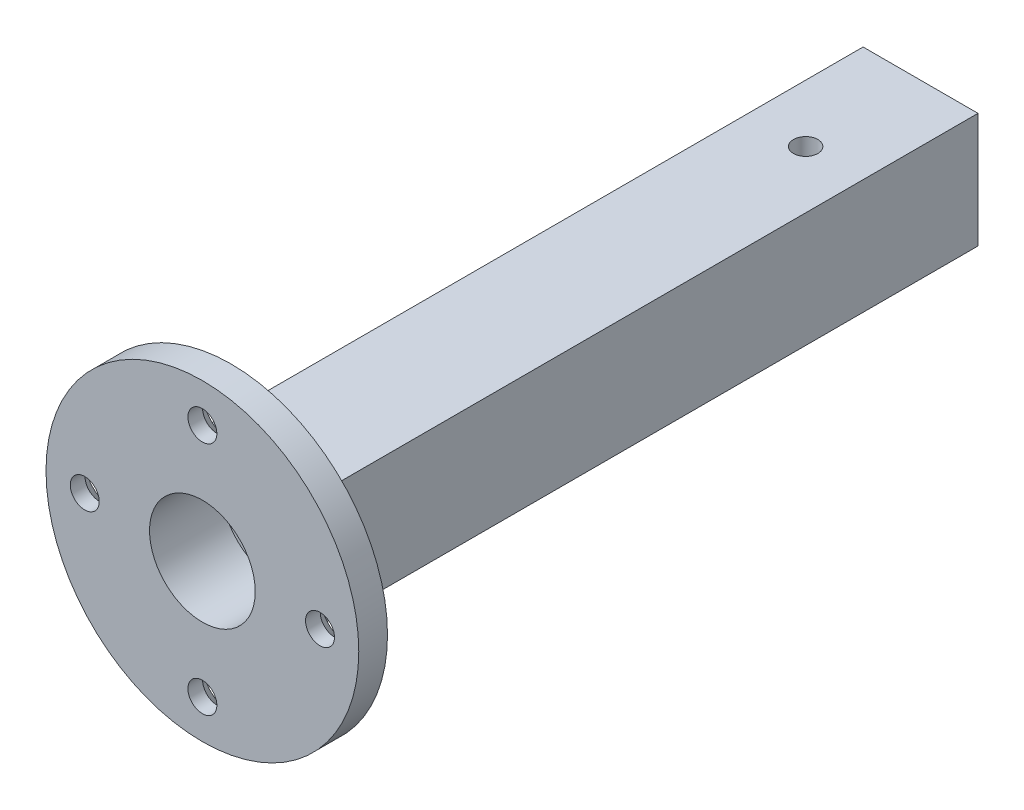
ISO-10303-21;
HEADER;
FILE_DESCRIPTION(('STEP AP214'),'2;1');
FILE_NAME('part.step','',(''),(''),'','','');
FILE_SCHEMA(('AUTOMOTIVE_DESIGN { 1 0 10303 214 1 1 1 1 }'));
ENDSEC;
DATA;
#1=APPLICATION_CONTEXT('core data for automotive mechanical design processes');
#2=APPLICATION_PROTOCOL_DEFINITION('international standard','automotive_design',2000,#1);
#3=PRODUCT_CONTEXT('',#1,'mechanical');
#4=PRODUCT('Part','Part','',(#3));
#5=PRODUCT_RELATED_PRODUCT_CATEGORY('part','',(#4));
#6=PRODUCT_DEFINITION_FORMATION('','',#4);
#7=PRODUCT_DEFINITION_CONTEXT('part definition',#1,'design');
#8=PRODUCT_DEFINITION('design','',#6,#7);
#9=PRODUCT_DEFINITION_SHAPE('','',#8);
#10=(LENGTH_UNIT() NAMED_UNIT(*) SI_UNIT(.MILLI.,.METRE.));
#11=(NAMED_UNIT(*) PLANE_ANGLE_UNIT() SI_UNIT($,.RADIAN.));
#12=(NAMED_UNIT(*) SI_UNIT($,.STERADIAN.) SOLID_ANGLE_UNIT());
#13=UNCERTAINTY_MEASURE_WITH_UNIT(LENGTH_MEASURE(1.E-05),#10,'distance_accuracy_value','');
#14=(GEOMETRIC_REPRESENTATION_CONTEXT(3) GLOBAL_UNCERTAINTY_ASSIGNED_CONTEXT((#13)) GLOBAL_UNIT_ASSIGNED_CONTEXT((#10,
#11,#12)) REPRESENTATION_CONTEXT('',''));
#15=CARTESIAN_POINT('',(0.,0.,0.));
#16=DIRECTION('',(0.,0.,1.));
#17=DIRECTION('',(1.,0.,0.));
#18=AXIS2_PLACEMENT_3D('',#15,#16,#17);
#19=CARTESIAN_POINT('',(6.35,6.35,71.375));
#20=DIRECTION('',(0.,0.,1.));
#21=DIRECTION('',(1.,0.,0.));
#22=AXIS2_PLACEMENT_3D('',#19,#20,#21);
#23=PLANE('',#22);
#24=CARTESIAN_POINT('',(6.35,6.35,71.375));
#25=DIRECTION('',(0.,0.,1.));
#26=DIRECTION('',(1.,0.,0.));
#27=AXIS2_PLACEMENT_3D('',#24,#25,#26);
#28=CIRCLE('',#27,5.842);
#29=CARTESIAN_POINT('',(12.192,6.35,71.375));
#30=VERTEX_POINT('',#29);
#31=EDGE_CURVE('E20',#30,#30,#28,.T.);
#32=ORIENTED_EDGE('',*,*,#31,.T.);
#33=EDGE_LOOP('',(#32));
#34=FACE_BOUND('',#33,.T.);
#35=ADVANCED_FACE('F17',(#34),#23,.T.);
#36=CARTESIAN_POINT('',(6.35,6.35,71.375));
#37=DIRECTION('',(0.,0.,1.));
#38=DIRECTION('',(1.,0.,0.));
#39=AXIS2_PLACEMENT_3D('',#36,#37,#38);
#40=CYLINDRICAL_SURFACE('',#39,5.842);
#41=CARTESIAN_POINT('',(6.35,6.35,79.375));
#42=DIRECTION('',(0.,0.,1.));
#43=DIRECTION('',(1.,0.,0.));
#44=AXIS2_PLACEMENT_3D('',#41,#42,#43);
#45=CIRCLE('',#44,5.842);
#46=CARTESIAN_POINT('',(12.192,6.35,79.375));
#47=VERTEX_POINT('',#46);
#48=EDGE_CURVE('E193',#47,#47,#45,.F.);
#49=ORIENTED_EDGE('',*,*,#48,.F.);
#50=EDGE_LOOP('',(#49));
#51=FACE_BOUND('',#50,.T.);
#52=ORIENTED_EDGE('',*,*,#31,.F.);
#53=EDGE_LOOP('',(#52));
#54=FACE_BOUND('',#53,.T.);
#55=ADVANCED_FACE('F182',(#51,#54),#40,.F.);
#56=CARTESIAN_POINT('',(6.35,6.35,25.4));
#57=DIRECTION('',(0.,0.,-1.));
#58=DIRECTION('',(-1.,0.,0.));
#59=AXIS2_PLACEMENT_3D('',#56,#57,#58);
#60=PLANE('',#59);
#61=CARTESIAN_POINT('',(6.35,6.35,25.4));
#62=DIRECTION('',(0.,0.,-1.));
#63=DIRECTION('',(-1.,0.,0.));
#64=AXIS2_PLACEMENT_3D('',#61,#62,#63);
#65=CIRCLE('',#64,4.064);
#66=CARTESIAN_POINT('',(2.286,6.35,25.4));
#67=VERTEX_POINT('',#66);
#68=EDGE_CURVE('E213',#67,#67,#65,.T.);
#69=ORIENTED_EDGE('',*,*,#68,.T.);
#70=EDGE_LOOP('',(#69));
#71=FACE_BOUND('',#70,.T.);
#72=ADVANCED_FACE('F179',(#71),#60,.T.);
#73=CARTESIAN_POINT('',(6.35,19.35,76.2));
#74=DIRECTION('',(0.,0.,-1.));
#75=DIRECTION('',(-1.,0.,0.));
#76=AXIS2_PLACEMENT_3D('',#73,#74,#75);
#77=CYLINDRICAL_SURFACE('',#76,1.6);
#78=CARTESIAN_POINT('',(6.35,19.35,79.375));
#79=DIRECTION('',(0.,0.,-1.));
#80=DIRECTION('',(-1.,0.,0.));
#81=AXIS2_PLACEMENT_3D('',#78,#79,#80);
#82=CIRCLE('',#81,1.6);
#83=CARTESIAN_POINT('',(4.75,19.35,79.375));
#84=VERTEX_POINT('',#83);
#85=EDGE_CURVE('E196',#84,#84,#82,.T.);
#86=ORIENTED_EDGE('',*,*,#85,.F.);
#87=EDGE_LOOP('',(#86));
#88=FACE_BOUND('',#87,.T.);
#89=CARTESIAN_POINT('',(6.35,19.35,77.7499999999804));
#90=DIRECTION('',(0.,0.,-1.));
#91=DIRECTION('',(-1.,0.,0.));
#92=AXIS2_PLACEMENT_3D('',#89,#90,#91);
#93=CIRCLE('',#92,1.59999999994179);
#94=CARTESIAN_POINT('',(4.75000000005821,19.35,77.7499999999804));
#95=VERTEX_POINT('',#94);
#96=EDGE_CURVE('E215',#95,#95,#93,.T.);
#97=ORIENTED_EDGE('',*,*,#96,.T.);
#98=EDGE_LOOP('',(#97));
#99=FACE_BOUND('',#98,.T.);
#100=ADVANCED_FACE('F175',(#88,#99),#77,.F.);
#101=CARTESIAN_POINT('',(-6.65,6.35,76.2));
#102=DIRECTION('',(0.,0.,-1.));
#103=DIRECTION('',(-1.,0.,0.));
#104=AXIS2_PLACEMENT_3D('',#101,#102,#103);
#105=CYLINDRICAL_SURFACE('',#104,1.6);
#106=CARTESIAN_POINT('',(-6.65,6.35,79.375));
#107=DIRECTION('',(0.,0.,-1.));
#108=DIRECTION('',(-1.,0.,0.));
#109=AXIS2_PLACEMENT_3D('',#106,#107,#108);
#110=CIRCLE('',#109,1.6);
#111=CARTESIAN_POINT('',(-8.25,6.35,79.375));
#112=VERTEX_POINT('',#111);
#113=EDGE_CURVE('E199',#112,#112,#110,.T.);
#114=ORIENTED_EDGE('',*,*,#113,.F.);
#115=EDGE_LOOP('',(#114));
#116=FACE_BOUND('',#115,.T.);
#117=CARTESIAN_POINT('',(-6.65,6.35,77.7500000000373));
#118=DIRECTION('',(0.,0.,-1.));
#119=DIRECTION('',(-1.,0.,0.));
#120=AXIS2_PLACEMENT_3D('',#117,#118,#119);
#121=CIRCLE('',#120,1.59999999997544);
#122=CARTESIAN_POINT('',(-8.24999999997544,6.35,77.7500000000373));
#123=VERTEX_POINT('',#122);
#124=EDGE_CURVE('E228',#123,#123,#121,.T.);
#125=ORIENTED_EDGE('',*,*,#124,.T.);
#126=EDGE_LOOP('',(#125));
#127=FACE_BOUND('',#126,.T.);
#128=ADVANCED_FACE('F171',(#116,#127),#105,.F.);
#129=CARTESIAN_POINT('',(6.35,-6.65,76.2));
#130=DIRECTION('',(0.,0.,-1.));
#131=DIRECTION('',(-1.,0.,0.));
#132=AXIS2_PLACEMENT_3D('',#129,#130,#131);
#133=CYLINDRICAL_SURFACE('',#132,1.6);
#134=CARTESIAN_POINT('',(6.35,-6.65,79.375));
#135=DIRECTION('',(0.,0.,-1.));
#136=DIRECTION('',(-1.,0.,0.));
#137=AXIS2_PLACEMENT_3D('',#134,#135,#136);
#138=CIRCLE('',#137,1.6);
#139=CARTESIAN_POINT('',(4.75,-6.65,79.375));
#140=VERTEX_POINT('',#139);
#141=EDGE_CURVE('E204',#140,#140,#138,.T.);
#142=ORIENTED_EDGE('',*,*,#141,.F.);
#143=EDGE_LOOP('',(#142));
#144=FACE_BOUND('',#143,.T.);
#145=CARTESIAN_POINT('',(6.35,-6.65,77.7499999999804));
#146=DIRECTION('',(0.,0.,-1.));
#147=DIRECTION('',(-1.,0.,0.));
#148=AXIS2_PLACEMENT_3D('',#145,#146,#147);
#149=CIRCLE('',#148,1.59999999994179);
#150=CARTESIAN_POINT('',(4.75000000005821,-6.65,77.7499999999804));
#151=VERTEX_POINT('',#150);
#152=EDGE_CURVE('E223',#151,#151,#149,.T.);
#153=ORIENTED_EDGE('',*,*,#152,.T.);
#154=EDGE_LOOP('',(#153));
#155=FACE_BOUND('',#154,.T.);
#156=ADVANCED_FACE('F167',(#144,#155),#133,.F.);
#157=CARTESIAN_POINT('',(19.35,6.35,76.2));
#158=DIRECTION('',(0.,0.,-1.));
#159=DIRECTION('',(-1.,0.,0.));
#160=AXIS2_PLACEMENT_3D('',#157,#158,#159);
#161=CYLINDRICAL_SURFACE('',#160,1.6);
#162=CARTESIAN_POINT('',(19.35,6.35,79.375));
#163=DIRECTION('',(0.,0.,-1.));
#164=DIRECTION('',(-1.,0.,0.));
#165=AXIS2_PLACEMENT_3D('',#162,#163,#164);
#166=CIRCLE('',#165,1.6);
#167=CARTESIAN_POINT('',(17.75,6.35,79.375));
#168=VERTEX_POINT('',#167);
#169=EDGE_CURVE('E207',#168,#168,#166,.T.);
#170=ORIENTED_EDGE('',*,*,#169,.F.);
#171=EDGE_LOOP('',(#170));
#172=FACE_BOUND('',#171,.T.);
#173=CARTESIAN_POINT('',(19.35,6.35,77.7499999999804));
#174=DIRECTION('',(0.,0.,-1.));
#175=DIRECTION('',(-1.,0.,0.));
#176=AXIS2_PLACEMENT_3D('',#173,#174,#175);
#177=CIRCLE('',#176,1.60000000002183);
#178=CARTESIAN_POINT('',(17.7499999999782,6.35,77.7499999999804));
#179=VERTEX_POINT('',#178);
#180=EDGE_CURVE('E218',#179,#179,#177,.T.);
#181=ORIENTED_EDGE('',*,*,#180,.T.);
#182=EDGE_LOOP('',(#181));
#183=FACE_BOUND('',#182,.T.);
#184=ADVANCED_FACE('F163',(#172,#183),#161,.F.);
#185=CARTESIAN_POINT('',(6.35,6.35,79.375));
#186=DIRECTION('',(0.,0.,1.));
#187=DIRECTION('',(1.,0.,0.));
#188=AXIS2_PLACEMENT_3D('',#185,#186,#187);
#189=PLANE('',#188);
#190=CARTESIAN_POINT('',(6.35,6.35,79.375));
#191=DIRECTION('',(0.,0.,-1.));
#192=DIRECTION('',(-1.,0.,0.));
#193=AXIS2_PLACEMENT_3D('',#190,#191,#192);
#194=CIRCLE('',#193,17.2847);
#195=CARTESIAN_POINT('',(-10.9347,6.35,79.375));
#196=VERTEX_POINT('',#195);
#197=EDGE_CURVE('E216',#196,#196,#194,.T.);
#198=ORIENTED_EDGE('',*,*,#197,.F.);
#199=EDGE_LOOP('',(#198));
#200=FACE_BOUND('',#199,.T.);
#201=ORIENTED_EDGE('',*,*,#169,.T.);
#202=EDGE_LOOP('',(#201));
#203=FACE_BOUND('',#202,.T.);
#204=ORIENTED_EDGE('',*,*,#141,.T.);
#205=EDGE_LOOP('',(#204));
#206=FACE_BOUND('',#205,.T.);
#207=ORIENTED_EDGE('',*,*,#113,.T.);
#208=EDGE_LOOP('',(#207));
#209=FACE_BOUND('',#208,.T.);
#210=ORIENTED_EDGE('',*,*,#85,.T.);
#211=EDGE_LOOP('',(#210));
#212=FACE_BOUND('',#211,.T.);
#213=ORIENTED_EDGE('',*,*,#48,.T.);
#214=EDGE_LOOP('',(#213));
#215=FACE_BOUND('',#214,.T.);
#216=ADVANCED_FACE('F159',(#200,#203,#206,#209,#212,#215),#189,.T.);
#217=CARTESIAN_POINT('',(6.35,6.35,2.54));
#218=DIRECTION('',(0.,0.,-1.));
#219=DIRECTION('',(-1.,0.,0.));
#220=AXIS2_PLACEMENT_3D('',#217,#218,#219);
#221=PLANE('',#220);
#222=CARTESIAN_POINT('',(6.35,6.35,2.54));
#223=DIRECTION('',(0.,0.,-1.));
#224=DIRECTION('',(-1.,0.,0.));
#225=AXIS2_PLACEMENT_3D('',#222,#223,#224);
#226=CIRCLE('',#225,4.064);
#227=CARTESIAN_POINT('',(2.286,6.35,2.54));
#228=VERTEX_POINT('',#227);
#229=EDGE_CURVE('E210',#228,#228,#226,.F.);
#230=ORIENTED_EDGE('',*,*,#229,.T.);
#231=EDGE_LOOP('',(#230));
#232=FACE_BOUND('',#231,.T.);
#233=CARTESIAN_POINT('',(6.35,6.35,2.54));
#234=DIRECTION('',(0.,0.,-1.));
#235=DIRECTION('',(-1.,0.,0.));
#236=AXIS2_PLACEMENT_3D('',#233,#234,#235);
#237=CIRCLE('',#236,5.715);
#238=CARTESIAN_POINT('',(0.635,6.35,2.54));
#239=VERTEX_POINT('',#238);
#240=EDGE_CURVE('E144',#239,#239,#237,.T.);
#241=ORIENTED_EDGE('',*,*,#240,.T.);
#242=EDGE_LOOP('',(#241));
#243=FACE_BOUND('',#242,.T.);
#244=ADVANCED_FACE('F154',(#232,#243),#221,.T.);
#245=CARTESIAN_POINT('',(6.35,6.35,25.4));
#246=DIRECTION('',(0.,0.,-1.));
#247=DIRECTION('',(-1.,0.,0.));
#248=AXIS2_PLACEMENT_3D('',#245,#246,#247);
#249=CYLINDRICAL_SURFACE('',#248,4.064);
#250=ORIENTED_EDGE('',*,*,#68,.F.);
#251=EDGE_LOOP('',(#250));
#252=FACE_BOUND('',#251,.T.);
#253=CARTESIAN_POINT('',(6.35,10.414,14.0462));
#254=CARTESIAN_POINT('',(6.42337725068263,10.4139970817414,14.0461958840372));
#255=CARTESIAN_POINT('',(6.49683034799387,10.4119911392292,14.0401726896086));
#256=CARTESIAN_POINT('',(6.64165056606288,10.4041728902857,14.0162821461656));
#257=CARTESIAN_POINT('',(6.71301399340299,10.3983542246992,13.9983950089376));
#258=CARTESIAN_POINT('',(6.85143131582236,10.3835464384941,13.9514583401956));
#259=CARTESIAN_POINT('',(6.91849462947059,10.3745645477265,13.9224342498108));
#260=CARTESIAN_POINT('',(7.04677718468758,10.3543501507096,13.8541399643643));
#261=CARTESIAN_POINT('',(7.10799715939339,10.3431179273486,13.8148710569872));
#262=CARTESIAN_POINT('',(7.22498855462116,10.3191521733989,13.725778478104));
#263=CARTESIAN_POINT('',(7.28053212970592,10.3063828870632,13.6756652515967));
#264=CARTESIAN_POINT('',(7.38260233734078,10.2809796041532,13.5669201128711));
#265=CARTESIAN_POINT('',(7.42912654223978,10.2683456448657,13.5082859145601));
#266=CARTESIAN_POINT('',(7.51312159308937,10.2442537360643,13.3821319447116));
#267=CARTESIAN_POINT('',(7.55029888690631,10.2328391991955,13.3144076322695));
#268=CARTESIAN_POINT('',(7.61263925413595,10.2130190305986,13.1732290148544));
#269=CARTESIAN_POINT('',(7.63780599788823,10.2046124798479,13.0997764683826));
#270=CARTESIAN_POINT('',(7.67456207299992,10.1921347055094,12.9518043382112));
#271=CARTESIAN_POINT('',(7.68657614062743,10.1879282739087,12.8774019959606));
#272=CARTESIAN_POINT('',(7.69801349904991,10.1839269426871,12.7275278183078));
#273=CARTESIAN_POINT('',(7.69744062153057,10.1841307005274,12.6520563153681));
#274=CARTESIAN_POINT('',(7.68405042301314,10.188808137311,12.5057977447744));
#275=CARTESIAN_POINT('',(7.67178596827526,10.1930890108968,12.4349528286485));
#276=CARTESIAN_POINT('',(7.6362619938443,10.2051231086533,12.2963891214457));
#277=CARTESIAN_POINT('',(7.61300112118828,10.2128767600969,12.22867071617));
#278=CARTESIAN_POINT('',(7.55577915481541,10.2311214327932,12.0970187816311));
#279=CARTESIAN_POINT('',(7.52165299959289,10.24165422021,12.0331630343833));
#280=CARTESIAN_POINT('',(7.44378566087358,10.2642519844407,11.911912418786));
#281=CARTESIAN_POINT('',(7.40004224482426,10.2763173167447,11.8545190553008));
#282=CARTESIAN_POINT('',(7.30152836482726,10.3013793690657,11.7447182196424));
#283=CARTESIAN_POINT('',(7.24630691968179,10.3143920976538,11.692718252167));
#284=CARTESIAN_POINT('',(7.12774487780615,10.3393450476096,11.598592975379));
#285=CARTESIAN_POINT('',(7.06440074866152,10.3512847984926,11.5564719849427));
#286=CARTESIAN_POINT('',(6.9305166658123,10.3729019729725,11.4829756859837));
#287=CARTESIAN_POINT('',(6.85990882232954,10.3825546177393,11.4517164995999));
#288=CARTESIAN_POINT('',(6.71411719977156,10.3983155478389,11.401698267001));
#289=CARTESIAN_POINT('',(6.63894313879362,10.4044310878569,11.3829136233871));
#290=CARTESIAN_POINT('',(6.52756240690538,10.4102730638345,11.3650851252126));
#291=CARTESIAN_POINT('',(6.4922026173001,10.4116664821543,11.3608584489485));
#292=CARTESIAN_POINT('',(6.42123451191006,10.4135306595724,11.3552148844162));
#293=CARTESIAN_POINT('',(6.385626195642,10.4140014168758,11.3537980016136));
#294=CARTESIAN_POINT('',(6.2766227493174,10.4139970817415,11.3538041159626));
#295=CARTESIAN_POINT('',(6.20316965200615,10.4119911392292,11.3598273103914));
#296=CARTESIAN_POINT('',(6.05834943393714,10.4041728902856,11.3837178538344));
#297=CARTESIAN_POINT('',(5.98698600659702,10.3983542246992,11.4016049910624));
#298=CARTESIAN_POINT('',(5.84856868417763,10.3835464384941,11.4485416598044));
#299=CARTESIAN_POINT('',(5.78150537052941,10.3745645477265,11.4775657501892));
#300=CARTESIAN_POINT('',(5.65322281531242,10.3543501507096,11.5458600356357));
#301=CARTESIAN_POINT('',(5.59200284060661,10.3431179273486,11.5851289430128));
#302=CARTESIAN_POINT('',(5.47501144537884,10.3191521733989,11.674221521896));
#303=CARTESIAN_POINT('',(5.41946787029408,10.3063828870632,11.7243347484033));
#304=CARTESIAN_POINT('',(5.31739766265923,10.2809796041532,11.8330798871289));
#305=CARTESIAN_POINT('',(5.27087345776022,10.2683456448657,11.8917140854399));
#306=CARTESIAN_POINT('',(5.18687840691063,10.2442537360643,12.0178680552884));
#307=CARTESIAN_POINT('',(5.14970111309369,10.2328391991955,12.0855923677305));
#308=CARTESIAN_POINT('',(5.08736074586405,10.2130190305986,12.2267709851456));
#309=CARTESIAN_POINT('',(5.06219400211177,10.2046124798479,12.3002235316174));
#310=CARTESIAN_POINT('',(5.02543792700008,10.1921347055094,12.4481956617888));
#311=CARTESIAN_POINT('',(5.01342385937257,10.1879282739087,12.5225980040394));
#312=CARTESIAN_POINT('',(5.00198650095009,10.1839269426871,12.6724721816923));
#313=CARTESIAN_POINT('',(5.00255937846943,10.1841307005274,12.7479436846319));
#314=CARTESIAN_POINT('',(5.01594957698686,10.188808137311,12.8942022552256));
#315=CARTESIAN_POINT('',(5.02821403172474,10.1930890108968,12.9650471713515));
#316=CARTESIAN_POINT('',(5.0637380061557,10.2051231086533,13.1036108785543));
#317=CARTESIAN_POINT('',(5.08699887881172,10.2128767600969,13.17132928383));
#318=CARTESIAN_POINT('',(5.14422084518459,10.2311214327932,13.3029812183689));
#319=CARTESIAN_POINT('',(5.17834700040711,10.24165422021,13.3668369656167));
#320=CARTESIAN_POINT('',(5.25621433912642,10.2642519844407,13.4880875812141));
#321=CARTESIAN_POINT('',(5.29995775517574,10.2763173167447,13.5454809446992));
#322=CARTESIAN_POINT('',(5.39847163517273,10.3013793690657,13.6552817803576));
#323=CARTESIAN_POINT('',(5.4536930803182,10.3143920976538,13.707281747833));
#324=CARTESIAN_POINT('',(5.57225512219385,10.3393450476096,13.801407024621));
#325=CARTESIAN_POINT('',(5.63559925133848,10.3512847984926,13.8435280150573));
#326=CARTESIAN_POINT('',(5.7694833341877,10.3729019729725,13.9170243140163));
#327=CARTESIAN_POINT('',(5.84009117767047,10.3825546177393,13.9482835004001));
#328=CARTESIAN_POINT('',(5.98588280022844,10.3983155478389,13.998301732999));
#329=CARTESIAN_POINT('',(6.06105686120638,10.4044310878569,14.0170863766129));
#330=CARTESIAN_POINT('',(6.17243759309462,10.4102730638345,14.0349148747874));
#331=CARTESIAN_POINT('',(6.20779738269991,10.4116664821543,14.0391415510515));
#332=CARTESIAN_POINT('',(6.27876548808995,10.4135306595724,14.0447851155838));
#333=CARTESIAN_POINT('',(6.31437380435801,10.4140014168758,14.0462019983863));
#334=CARTESIAN_POINT('',(6.35,10.414,14.0462));
#335=B_SPLINE_CURVE_WITH_KNOTS('',3,(#253,#254,#255,#256,#257,#258,#259,#260,#261,#262,#263,
#264,#265,#266,#267,#268,#269,#270,#271,#272,#273,#274,#275,#276,#277,#278,#279,#280,#281,#282,
#283,#284,#285,#286,#287,#288,#289,#290,#291,#292,#293,#294,#295,#296,#297,#298,#299,#300,#301,
#302,#303,#304,#305,#306,#307,#308,#309,#310,#311,#312,#313,#314,#315,#316,#317,#318,#319,#320,
#321,#322,#323,#324,#325,#326,#327,#328,#329,#330,#331,#332,#333,#334),.UNSPECIFIED.,.T.,.F.,(4,
2,2,2,2,2,2,2,2,2,2,2,2,2,2,2,2,2,2,2,2,2,2,2,2,2,2,2,2,2,2,2,2,2,2,2,2,2,2,2,4),(0.,
0.219994311977115,0.440356484688137,0.66021823293809,0.880052359778379,1.1067039093906,
1.33341638002637,1.566546390797,1.79960511298509,2.02489288227896,2.25011207099596,
2.46518346068521,2.68028131893761,2.89881669758586,3.11740286073974,3.3472162974275,
3.57713001710668,3.80943110502767,4.04125403273008,4.14806568184524,4.25487753873151,
4.47487185070862,4.69523402341968,4.91509577166964,5.13492989850992,5.36158144812213,
5.58829391875791,5.82142392952854,6.05448265171663,6.2797704210105,6.5049896097275,
6.72006099941675,6.93515885766915,7.15369423631739,7.37228039947128,7.60209383615903,
7.83200755583822,8.06430864375922,8.29613157146162,8.40294322057678,8.50975507746306),.UNSPECIFIED.);
#336=CARTESIAN_POINT('',(6.35,10.414,14.0462));
#337=VERTEX_POINT('',#336);
#338=EDGE_CURVE('E136',#337,#337,#335,.T.);
#339=ORIENTED_EDGE('',*,*,#338,.T.);
#340=EDGE_LOOP('',(#339));
#341=FACE_BOUND('',#340,.T.);
#342=ORIENTED_EDGE('',*,*,#229,.F.);
#343=EDGE_LOOP('',(#342));
#344=FACE_BOUND('',#343,.T.);
#345=ADVANCED_FACE('F148',(#252,#341,#344),#249,.F.);
#346=CARTESIAN_POINT('',(6.35,19.35,76.2000000000285));
#347=DIRECTION('',(0.,0.,-1.));
#348=DIRECTION('',(-1.,0.,0.));
#349=AXIS2_PLACEMENT_3D('',#346,#347,#348);
#350=CONICAL_SURFACE('',#349,3.14999999995061,0.785398163415785);
#351=ORIENTED_EDGE('',*,*,#96,.F.);
#352=EDGE_LOOP('',(#351));
#353=FACE_BOUND('',#352,.T.);
#354=CARTESIAN_POINT('',(6.35,19.35,76.199999999974));
#355=DIRECTION('',(0.,0.,-1.));
#356=DIRECTION('',(-1.,0.,0.));
#357=AXIS2_PLACEMENT_3D('',#354,#355,#356);
#358=CIRCLE('',#357,3.15000000000509);
#359=CARTESIAN_POINT('',(3.1999999999949,19.35,76.199999999974));
#360=VERTEX_POINT('',#359);
#361=EDGE_CURVE('E145',#360,#360,#358,.T.);
#362=ORIENTED_EDGE('',*,*,#361,.T.);
#363=EDGE_LOOP('',(#362));
#364=FACE_BOUND('',#363,.T.);
#365=ADVANCED_FACE('F153',(#353,#364),#350,.F.);
#366=CARTESIAN_POINT('',(-6.65,6.35,76.2000000000853));
#367=DIRECTION('',(0.,0.,-1.));
#368=DIRECTION('',(-1.,0.,0.));
#369=AXIS2_PLACEMENT_3D('',#366,#367,#368);
#370=CONICAL_SURFACE('',#369,3.14999999987058,0.785398163397448);
#371=ORIENTED_EDGE('',*,*,#124,.F.);
#372=EDGE_LOOP('',(#371));
#373=FACE_BOUND('',#372,.T.);
#374=CARTESIAN_POINT('',(-6.65,6.35,76.2000000000285));
#375=DIRECTION('',(0.,0.,-1.));
#376=DIRECTION('',(-1.,0.,0.));
#377=AXIS2_PLACEMENT_3D('',#374,#375,#376);
#378=CIRCLE('',#377,3.14999999992742);
#379=CARTESIAN_POINT('',(-9.79999999992742,6.35,76.2000000000285));
#380=VERTEX_POINT('',#379);
#381=EDGE_CURVE('E264',#380,#380,#378,.T.);
#382=ORIENTED_EDGE('',*,*,#381,.T.);
#383=EDGE_LOOP('',(#382));
#384=FACE_BOUND('',#383,.T.);
#385=ADVANCED_FACE('F329',(#373,#384),#370,.F.);
#386=CARTESIAN_POINT('',(6.35,-6.65,76.2000000000285));
#387=DIRECTION('',(0.,0.,-1.));
#388=DIRECTION('',(-1.,0.,0.));
#389=AXIS2_PLACEMENT_3D('',#386,#387,#388);
#390=CONICAL_SURFACE('',#389,3.14999999995061,0.785398163415785);
#391=ORIENTED_EDGE('',*,*,#152,.F.);
#392=EDGE_LOOP('',(#391));
#393=FACE_BOUND('',#392,.T.);
#394=CARTESIAN_POINT('',(6.35,-6.65,76.199999999974));
#395=DIRECTION('',(0.,0.,-1.));
#396=DIRECTION('',(-1.,0.,0.));
#397=AXIS2_PLACEMENT_3D('',#394,#395,#396);
#398=CIRCLE('',#397,3.15000000000509);
#399=CARTESIAN_POINT('',(3.1999999999949,-6.65,76.199999999974));
#400=VERTEX_POINT('',#399);
#401=EDGE_CURVE('E262',#400,#400,#398,.T.);
#402=ORIENTED_EDGE('',*,*,#401,.T.);
#403=EDGE_LOOP('',(#402));
#404=FACE_BOUND('',#403,.T.);
#405=ADVANCED_FACE('F326',(#393,#404),#390,.F.);
#406=CARTESIAN_POINT('',(19.35,6.35,76.1999999999716));
#407=DIRECTION('',(0.,0.,-1.));
#408=DIRECTION('',(-1.,0.,0.));
#409=AXIS2_PLACEMENT_3D('',#406,#407,#408);
#410=CONICAL_SURFACE('',#409,3.14999999997381,0.785398163397448);
#411=ORIENTED_EDGE('',*,*,#180,.F.);
#412=EDGE_LOOP('',(#411));
#413=FACE_BOUND('',#412,.T.);
#414=CARTESIAN_POINT('',(19.35,6.35,76.1999999999716));
#415=DIRECTION('',(0.,0.,-1.));
#416=DIRECTION('',(-1.,0.,0.));
#417=AXIS2_PLACEMENT_3D('',#414,#415,#416);
#418=CIRCLE('',#417,3.14999999997381);
#419=CARTESIAN_POINT('',(16.2000000000262,6.35,76.1999999999716));
#420=VERTEX_POINT('',#419);
#421=EDGE_CURVE('E259',#420,#420,#418,.T.);
#422=ORIENTED_EDGE('',*,*,#421,.T.);
#423=EDGE_LOOP('',(#422));
#424=FACE_BOUND('',#423,.T.);
#425=ADVANCED_FACE('F321',(#413,#424),#410,.F.);
#426=CARTESIAN_POINT('',(6.35,6.35,79.375));
#427=DIRECTION('',(0.,0.,-1.));
#428=DIRECTION('',(-1.,0.,0.));
#429=AXIS2_PLACEMENT_3D('',#426,#427,#428);
#430=CYLINDRICAL_SURFACE('',#429,17.2847);
#431=ORIENTED_EDGE('',*,*,#197,.T.);
#432=EDGE_LOOP('',(#431));
#433=FACE_BOUND('',#432,.T.);
#434=CARTESIAN_POINT('',(6.35,6.35,76.2));
#435=DIRECTION('',(0.,0.,-1.));
#436=DIRECTION('',(-1.,0.,0.));
#437=AXIS2_PLACEMENT_3D('',#434,#435,#436);
#438=CIRCLE('',#437,17.2847);
#439=CARTESIAN_POINT('',(-10.9347,6.35,76.2));
#440=VERTEX_POINT('',#439);
#441=EDGE_CURVE('E256',#440,#440,#438,.F.);
#442=ORIENTED_EDGE('',*,*,#441,.T.);
#443=EDGE_LOOP('',(#442));
#444=FACE_BOUND('',#443,.T.);
#445=ADVANCED_FACE('F315',(#433,#444),#430,.T.);
#446=CARTESIAN_POINT('',(13.97,6.35,74.93));
#447=DIRECTION('',(0.,-1.,0.));
#448=DIRECTION('',(0.,0.,-1.));
#449=AXIS2_PLACEMENT_3D('',#446,#447,#448);
#450=CYLINDRICAL_SURFACE('',#449,1.26999999999999);
#451=DIRECTION('',(0.,1.,0.));
#452=VECTOR('',#451,1.);
#453=CARTESIAN_POINT('',(13.97,6.35,76.2));
#454=LINE('',#453,#452);
#455=CARTESIAN_POINT('',(13.97,13.97,76.2));
#456=VERTEX_POINT('',#455);
#457=CARTESIAN_POINT('',(13.97,-1.27,76.2));
#458=VERTEX_POINT('',#457);
#459=EDGE_CURVE('E143',#456,#458,#454,.F.);
#460=ORIENTED_EDGE('',*,*,#459,.T.);
#461=CARTESIAN_POINT('',(13.97,-1.27,74.93));
#462=DIRECTION('',(-0.707106781186547,-0.707106781186547,0.));
#463=DIRECTION('',(0.707106781186547,-0.707106781186547,0.));
#464=AXIS2_PLACEMENT_3D('',#461,#462,#463);
#465=ELLIPSE('',#464,1.79605122421382,1.26999999999999);
#466=CARTESIAN_POINT('',(12.7,0.,74.93));
#467=VERTEX_POINT('',#466);
#468=EDGE_CURVE('E250',#458,#467,#465,.T.);
#469=ORIENTED_EDGE('',*,*,#468,.T.);
#470=DIRECTION('',(0.,1.,0.));
#471=VECTOR('',#470,1.);
#472=CARTESIAN_POINT('',(12.7,0.,74.93));
#473=LINE('',#472,#471);
#474=CARTESIAN_POINT('',(12.7,12.7,74.93));
#475=VERTEX_POINT('',#474);
#476=EDGE_CURVE('E249',#467,#475,#473,.T.);
#477=ORIENTED_EDGE('',*,*,#476,.T.);
#478=CARTESIAN_POINT('',(13.97,13.97,74.93));
#479=DIRECTION('',(0.707106781186547,-0.707106781186547,0.));
#480=DIRECTION('',(-0.707106781186547,-0.707106781186547,0.));
#481=AXIS2_PLACEMENT_3D('',#478,#479,#480);
#482=ELLIPSE('',#481,1.79605122421382,1.26999999999999);
#483=EDGE_CURVE('E58',#475,#456,#482,.F.);
#484=ORIENTED_EDGE('',*,*,#483,.T.);
#485=EDGE_LOOP('',(#460,#469,#477,#484));
#486=FACE_BOUND('',#485,.T.);
#487=ADVANCED_FACE('F274',(#486),#450,.F.);
#488=CARTESIAN_POINT('',(6.35,6.35,2.54));
#489=DIRECTION('',(0.,0.,-1.));
#490=DIRECTION('',(-1.,0.,0.));
#491=AXIS2_PLACEMENT_3D('',#488,#489,#490);
#492=CYLINDRICAL_SURFACE('',#491,5.715);
#493=CARTESIAN_POINT('',(6.35,6.35,0.));
#494=DIRECTION('',(0.,0.,-1.));
#495=DIRECTION('',(-1.,0.,0.));
#496=AXIS2_PLACEMENT_3D('',#493,#494,#495);
#497=CIRCLE('',#496,5.715);
#498=CARTESIAN_POINT('',(0.635,6.35,0.));
#499=VERTEX_POINT('',#498);
#500=EDGE_CURVE('E246',#499,#499,#497,.F.);
#501=ORIENTED_EDGE('',*,*,#500,.F.);
#502=EDGE_LOOP('',(#501));
#503=FACE_BOUND('',#502,.T.);
#504=ORIENTED_EDGE('',*,*,#240,.F.);
#505=EDGE_LOOP('',(#504));
#506=FACE_BOUND('',#505,.T.);
#507=ADVANCED_FACE('F132',(#503,#506),#492,.F.);
#508=CARTESIAN_POINT('',(6.35,4.7,12.7));
#509=DIRECTION('',(0.,1.,0.));
#510=DIRECTION('',(0.,0.,1.));
#511=AXIS2_PLACEMENT_3D('',#508,#509,#510);
#512=CYLINDRICAL_SURFACE('',#511,1.3462);
#513=ORIENTED_EDGE('',*,*,#338,.F.);
#514=EDGE_LOOP('',(#513));
#515=FACE_BOUND('',#514,.T.);
#516=CARTESIAN_POINT('',(6.35,12.7,12.7));
#517=DIRECTION('',(0.,1.,0.));
#518=DIRECTION('',(0.,0.,1.));
#519=AXIS2_PLACEMENT_3D('',#516,#517,#518);
#520=CIRCLE('',#519,1.3462);
#521=CARTESIAN_POINT('',(6.35,12.7,14.0462));
#522=VERTEX_POINT('',#521);
#523=EDGE_CURVE('E242',#522,#522,#520,.T.);
#524=ORIENTED_EDGE('',*,*,#523,.T.);
#525=EDGE_LOOP('',(#524));
#526=FACE_BOUND('',#525,.T.);
#527=ADVANCED_FACE('F127',(#515,#526),#512,.F.);
#528=CARTESIAN_POINT('',(6.35,6.35,76.2));
#529=DIRECTION('',(0.,0.,1.));
#530=DIRECTION('',(1.,0.,0.));
#531=AXIS2_PLACEMENT_3D('',#528,#529,#530);
#532=PLANE('',#531);
#533=ORIENTED_EDGE('',*,*,#441,.F.);
#534=EDGE_LOOP('',(#533));
#535=FACE_BOUND('',#534,.T.);
#536=ORIENTED_EDGE('',*,*,#421,.F.);
#537=EDGE_LOOP('',(#536));
#538=FACE_BOUND('',#537,.T.);
#539=ORIENTED_EDGE('',*,*,#401,.F.);
#540=EDGE_LOOP('',(#539));
#541=FACE_BOUND('',#540,.T.);
#542=ORIENTED_EDGE('',*,*,#381,.F.);
#543=EDGE_LOOP('',(#542));
#544=FACE_BOUND('',#543,.T.);
#545=ORIENTED_EDGE('',*,*,#361,.F.);
#546=EDGE_LOOP('',(#545));
#547=FACE_BOUND('',#546,.T.);
#548=DIRECTION('',(-1.,0.,0.));
#549=VECTOR('',#548,1.);
#550=CARTESIAN_POINT('',(6.35,-1.27,76.2));
#551=LINE('',#550,#549);
#552=CARTESIAN_POINT('',(-1.27,-1.27,76.2));
#553=VERTEX_POINT('',#552);
#554=EDGE_CURVE('E253',#553,#458,#551,.F.);
#555=ORIENTED_EDGE('',*,*,#554,.T.);
#556=ORIENTED_EDGE('',*,*,#459,.F.);
#557=DIRECTION('',(1.,0.,0.));
#558=VECTOR('',#557,1.);
#559=CARTESIAN_POINT('',(6.35,13.97,76.2));
#560=LINE('',#559,#558);
#561=CARTESIAN_POINT('',(-1.27,13.97,76.2));
#562=VERTEX_POINT('',#561);
#563=EDGE_CURVE('E255',#456,#562,#560,.F.);
#564=ORIENTED_EDGE('',*,*,#563,.T.);
#565=DIRECTION('',(0.,1.,0.));
#566=VECTOR('',#565,1.);
#567=CARTESIAN_POINT('',(-1.27,6.35,76.2));
#568=LINE('',#567,#566);
#569=EDGE_CURVE('E241',#562,#553,#568,.F.);
#570=ORIENTED_EDGE('',*,*,#569,.T.);
#571=EDGE_LOOP('',(#555,#556,#564,#570));
#572=FACE_BOUND('',#571,.T.);
#573=ADVANCED_FACE('F124',(#535,#538,#541,#544,#547,#572),#532,.F.);
#574=CARTESIAN_POINT('',(6.35,13.97,74.93));
#575=DIRECTION('',(1.,0.,0.));
#576=DIRECTION('',(0.,0.,-1.));
#577=AXIS2_PLACEMENT_3D('',#574,#575,#576);
#578=CYLINDRICAL_SURFACE('',#577,1.26999999999999);
#579=DIRECTION('',(1.,0.,0.));
#580=VECTOR('',#579,1.);
#581=CARTESIAN_POINT('',(0.,12.7,74.93));
#582=LINE('',#581,#580);
#583=CARTESIAN_POINT('',(0.,12.7,74.93));
#584=VERTEX_POINT('',#583);
#585=EDGE_CURVE('E294',#475,#584,#582,.F.);
#586=ORIENTED_EDGE('',*,*,#585,.T.);
#587=CARTESIAN_POINT('',(-1.27,13.97,74.93));
#588=DIRECTION('',(0.707106781186547,0.707106781186547,0.));
#589=DIRECTION('',(0.707106781186547,-0.707106781186547,0.));
#590=AXIS2_PLACEMENT_3D('',#587,#588,#589);
#591=ELLIPSE('',#590,1.79605122421382,1.26999999999999);
#592=EDGE_CURVE('E93',#584,#562,#591,.F.);
#593=ORIENTED_EDGE('',*,*,#592,.T.);
#594=ORIENTED_EDGE('',*,*,#563,.F.);
#595=ORIENTED_EDGE('',*,*,#483,.F.);
#596=EDGE_LOOP('',(#586,#593,#594,#595));
#597=FACE_BOUND('',#596,.T.);
#598=ADVANCED_FACE('F120',(#597),#578,.F.);
#599=CARTESIAN_POINT('',(6.35,-1.27,74.93));
#600=DIRECTION('',(-1.,0.,0.));
#601=DIRECTION('',(0.,0.,1.));
#602=AXIS2_PLACEMENT_3D('',#599,#600,#601);
#603=CYLINDRICAL_SURFACE('',#602,1.26999999999999);
#604=DIRECTION('',(1.,0.,0.));
#605=VECTOR('',#604,1.);
#606=CARTESIAN_POINT('',(0.,0.,74.93));
#607=LINE('',#606,#605);
#608=CARTESIAN_POINT('',(0.,0.,74.93));
#609=VERTEX_POINT('',#608);
#610=EDGE_CURVE('E34',#609,#467,#607,.T.);
#611=ORIENTED_EDGE('',*,*,#610,.T.);
#612=ORIENTED_EDGE('',*,*,#468,.F.);
#613=ORIENTED_EDGE('',*,*,#554,.F.);
#614=CARTESIAN_POINT('',(-1.27,-1.27,74.93));
#615=DIRECTION('',(-0.707106781186547,0.707106781186547,0.));
#616=DIRECTION('',(-0.707106781186547,-0.707106781186547,0.));
#617=AXIS2_PLACEMENT_3D('',#614,#615,#616);
#618=ELLIPSE('',#617,1.79605122421382,1.26999999999999);
#619=EDGE_CURVE('E239',#553,#609,#618,.T.);
#620=ORIENTED_EDGE('',*,*,#619,.T.);
#621=EDGE_LOOP('',(#611,#612,#613,#620));
#622=FACE_BOUND('',#621,.T.);
#623=ADVANCED_FACE('F117',(#622),#603,.F.);
#624=CARTESIAN_POINT('',(12.7,0.,76.2));
#625=DIRECTION('',(-1.,0.,0.));
#626=DIRECTION('',(0.,0.,1.));
#627=AXIS2_PLACEMENT_3D('',#624,#625,#626);
#628=PLANE('',#627);
#629=ORIENTED_EDGE('',*,*,#476,.F.);
#630=DIRECTION('',(0.,0.,1.));
#631=VECTOR('',#630,1.);
#632=CARTESIAN_POINT('',(12.7,0.,76.2));
#633=LINE('',#632,#631);
#634=CARTESIAN_POINT('',(12.7,0.,0.));
#635=VERTEX_POINT('',#634);
#636=EDGE_CURVE('E87',#467,#635,#633,.F.);
#637=ORIENTED_EDGE('',*,*,#636,.T.);
#638=DIRECTION('',(0.,1.,0.));
#639=VECTOR('',#638,1.);
#640=CARTESIAN_POINT('',(12.7,0.,0.));
#641=LINE('',#640,#639);
#642=CARTESIAN_POINT('',(12.7,12.7,0.));
#643=VERTEX_POINT('',#642);
#644=EDGE_CURVE('E67',#643,#635,#641,.F.);
#645=ORIENTED_EDGE('',*,*,#644,.F.);
#646=DIRECTION('',(0.,0.,-1.));
#647=VECTOR('',#646,1.);
#648=CARTESIAN_POINT('',(12.7,12.7,76.2));
#649=LINE('',#648,#647);
#650=EDGE_CURVE('E293',#643,#475,#649,.F.);
#651=ORIENTED_EDGE('',*,*,#650,.T.);
#652=EDGE_LOOP('',(#629,#637,#645,#651));
#653=FACE_BOUND('',#652,.T.);
#654=ADVANCED_FACE('F114',(#653),#628,.F.);
#655=CARTESIAN_POINT('',(0.,0.,0.));
#656=DIRECTION('',(0.,0.,-1.));
#657=DIRECTION('',(-1.,0.,0.));
#658=AXIS2_PLACEMENT_3D('',#655,#656,#657);
#659=PLANE('',#658);
#660=ORIENTED_EDGE('',*,*,#644,.T.);
#661=DIRECTION('',(1.,0.,0.));
#662=VECTOR('',#661,1.);
#663=CARTESIAN_POINT('',(0.,0.,0.));
#664=LINE('',#663,#662);
#665=CARTESIAN_POINT('',(0.,0.,0.));
#666=VERTEX_POINT('',#665);
#667=EDGE_CURVE('E90',#635,#666,#664,.F.);
#668=ORIENTED_EDGE('',*,*,#667,.T.);
#669=DIRECTION('',(0.,1.,0.));
#670=VECTOR('',#669,1.);
#671=CARTESIAN_POINT('',(0.,0.,0.));
#672=LINE('',#671,#670);
#673=CARTESIAN_POINT('',(0.,12.7,0.));
#674=VERTEX_POINT('',#673);
#675=EDGE_CURVE('E78',#666,#674,#672,.T.);
#676=ORIENTED_EDGE('',*,*,#675,.T.);
#677=DIRECTION('',(1.,0.,0.));
#678=VECTOR('',#677,1.);
#679=CARTESIAN_POINT('',(0.,12.7,0.));
#680=LINE('',#679,#678);
#681=EDGE_CURVE('E245',#674,#643,#680,.T.);
#682=ORIENTED_EDGE('',*,*,#681,.T.);
#683=EDGE_LOOP('',(#660,#668,#676,#682));
#684=FACE_BOUND('',#683,.T.);
#685=ORIENTED_EDGE('',*,*,#500,.T.);
#686=EDGE_LOOP('',(#685));
#687=FACE_BOUND('',#686,.T.);
#688=ADVANCED_FACE('F91',(#684,#687),#659,.T.);
#689=CARTESIAN_POINT('',(0.,12.7,76.2));
#690=DIRECTION('',(0.,-1.,0.));
#691=DIRECTION('',(0.,0.,-1.));
#692=AXIS2_PLACEMENT_3D('',#689,#690,#691);
#693=PLANE('',#692);
#694=ORIENTED_EDGE('',*,*,#585,.F.);
#695=ORIENTED_EDGE('',*,*,#650,.F.);
#696=ORIENTED_EDGE('',*,*,#681,.F.);
#697=DIRECTION('',(0.,0.,-1.));
#698=VECTOR('',#697,1.);
#699=CARTESIAN_POINT('',(0.,12.7,76.2));
#700=LINE('',#699,#698);
#701=EDGE_CURVE('E84',#674,#584,#700,.F.);
#702=ORIENTED_EDGE('',*,*,#701,.T.);
#703=EDGE_LOOP('',(#694,#695,#696,#702));
#704=FACE_BOUND('',#703,.T.);
#705=ORIENTED_EDGE('',*,*,#523,.F.);
#706=EDGE_LOOP('',(#705));
#707=FACE_BOUND('',#706,.T.);
#708=ADVANCED_FACE('F105',(#704,#707),#693,.F.);
#709=CARTESIAN_POINT('',(-1.27,6.35,74.93));
#710=DIRECTION('',(0.,1.,0.));
#711=DIRECTION('',(0.,0.,1.));
#712=AXIS2_PLACEMENT_3D('',#709,#710,#711);
#713=CYLINDRICAL_SURFACE('',#712,1.26999999999999);
#714=DIRECTION('',(0.,1.,0.));
#715=VECTOR('',#714,1.);
#716=CARTESIAN_POINT('',(0.,0.,74.93));
#717=LINE('',#716,#715);
#718=EDGE_CURVE('E26',#584,#609,#717,.F.);
#719=ORIENTED_EDGE('',*,*,#718,.T.);
#720=ORIENTED_EDGE('',*,*,#619,.F.);
#721=ORIENTED_EDGE('',*,*,#569,.F.);
#722=ORIENTED_EDGE('',*,*,#592,.F.);
#723=EDGE_LOOP('',(#719,#720,#721,#722));
#724=FACE_BOUND('',#723,.T.);
#725=ADVANCED_FACE('F97',(#724),#713,.F.);
#726=CARTESIAN_POINT('',(0.,0.,76.2));
#727=DIRECTION('',(0.,1.,0.));
#728=DIRECTION('',(0.,0.,1.));
#729=AXIS2_PLACEMENT_3D('',#726,#727,#728);
#730=PLANE('',#729);
#731=ORIENTED_EDGE('',*,*,#610,.F.);
#732=DIRECTION('',(0.,0.,-1.));
#733=VECTOR('',#732,1.);
#734=CARTESIAN_POINT('',(0.,0.,76.2));
#735=LINE('',#734,#733);
#736=EDGE_CURVE('E10',#609,#666,#735,.T.);
#737=ORIENTED_EDGE('',*,*,#736,.T.);
#738=ORIENTED_EDGE('',*,*,#667,.F.);
#739=ORIENTED_EDGE('',*,*,#636,.F.);
#740=EDGE_LOOP('',(#731,#737,#738,#739));
#741=FACE_BOUND('',#740,.T.);
#742=ADVANCED_FACE('F95',(#741),#730,.F.);
#743=CARTESIAN_POINT('',(0.,0.,76.2));
#744=DIRECTION('',(1.,0.,0.));
#745=DIRECTION('',(0.,0.,-1.));
#746=AXIS2_PLACEMENT_3D('',#743,#744,#745);
#747=PLANE('',#746);
#748=ORIENTED_EDGE('',*,*,#718,.F.);
#749=ORIENTED_EDGE('',*,*,#701,.F.);
#750=ORIENTED_EDGE('',*,*,#675,.F.);
#751=ORIENTED_EDGE('',*,*,#736,.F.);
#752=EDGE_LOOP('',(#748,#749,#750,#751));
#753=FACE_BOUND('',#752,.T.);
#754=ADVANCED_FACE('F81',(#753),#747,.F.);
#755=CLOSED_SHELL('',(#35,#55,#72,#100,#128,#156,#184,#216,#244,#345,#365,#385,#405,#425,#445,
#487,#507,#527,#573,#598,#623,#654,#688,#708,#725,#742,#754));
#756=MANIFOLD_SOLID_BREP('B1',#755);
#757=ADVANCED_BREP_SHAPE_REPRESENTATION('',(#18,#756),#14);
#758=SHAPE_DEFINITION_REPRESENTATION(#9,#757);
ENDSEC;
END-ISO-10303-21;
